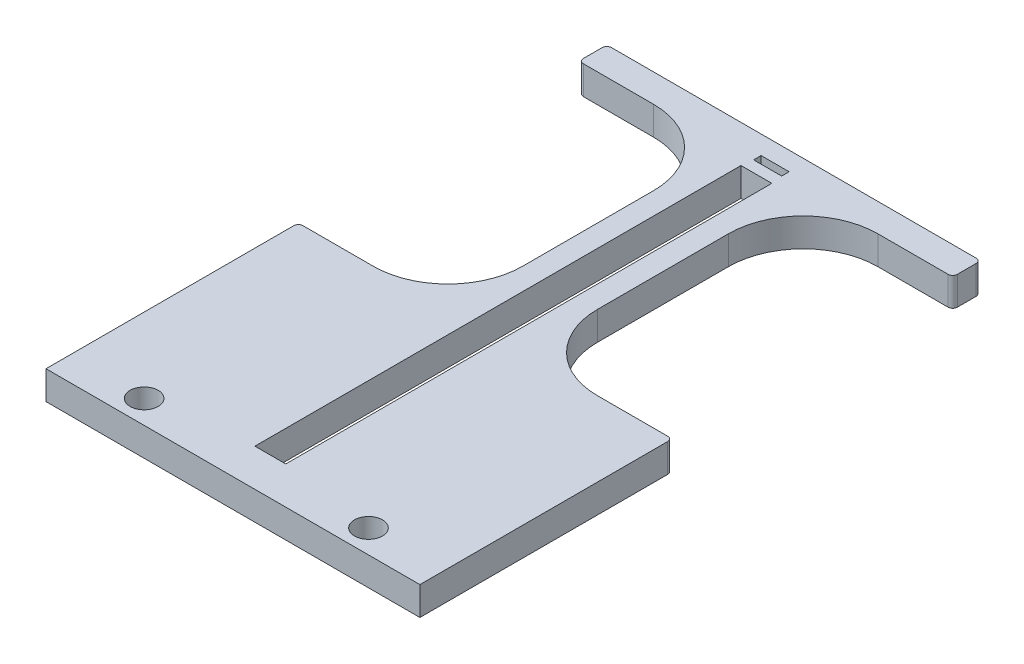
ISO-10303-21;
HEADER;
FILE_DESCRIPTION(('STEP AP214'),'2;1');
FILE_NAME('part.step','',(''),(''),'','','');
FILE_SCHEMA(('AUTOMOTIVE_DESIGN { 1 0 10303 214 1 1 1 1 }'));
ENDSEC;
DATA;
#1=APPLICATION_CONTEXT('core data for automotive mechanical design processes');
#2=APPLICATION_PROTOCOL_DEFINITION('international standard','automotive_design',2000,#1);
#3=PRODUCT_CONTEXT('',#1,'mechanical');
#4=PRODUCT('Part','Part','',(#3));
#5=PRODUCT_RELATED_PRODUCT_CATEGORY('part','',(#4));
#6=PRODUCT_DEFINITION_FORMATION('','',#4);
#7=PRODUCT_DEFINITION_CONTEXT('part definition',#1,'design');
#8=PRODUCT_DEFINITION('design','',#6,#7);
#9=PRODUCT_DEFINITION_SHAPE('','',#8);
#10=(LENGTH_UNIT() NAMED_UNIT(*) SI_UNIT(.MILLI.,.METRE.));
#11=(NAMED_UNIT(*) PLANE_ANGLE_UNIT() SI_UNIT($,.RADIAN.));
#12=(NAMED_UNIT(*) SI_UNIT($,.STERADIAN.) SOLID_ANGLE_UNIT());
#13=UNCERTAINTY_MEASURE_WITH_UNIT(LENGTH_MEASURE(1.E-05),#10,'distance_accuracy_value','');
#14=(GEOMETRIC_REPRESENTATION_CONTEXT(3) GLOBAL_UNCERTAINTY_ASSIGNED_CONTEXT((#13)) GLOBAL_UNIT_ASSIGNED_CONTEXT((#10,
#11,#12)) REPRESENTATION_CONTEXT('',''));
#15=CARTESIAN_POINT('',(0.,0.,0.));
#16=DIRECTION('',(0.,0.,1.));
#17=DIRECTION('',(1.,0.,0.));
#18=AXIS2_PLACEMENT_3D('',#15,#16,#17);
#19=CARTESIAN_POINT('',(40.,3.05,0.));
#20=DIRECTION('',(-1.,0.,0.));
#21=DIRECTION('',(0.,0.,1.));
#22=AXIS2_PLACEMENT_3D('',#19,#20,#21);
#23=PLANE('',#22);
#24=DIRECTION('',(0.,0.,-1.));
#25=VECTOR('',#24,1.);
#26=CARTESIAN_POINT('',(40.,0.,0.));
#27=LINE('',#26,#25);
#28=CARTESIAN_POINT('',(40.,0.,0.));
#29=VERTEX_POINT('',#28);
#30=CARTESIAN_POINT('',(40.,0.,-26.5));
#31=VERTEX_POINT('',#30);
#32=EDGE_CURVE('E406',#29,#31,#27,.T.);
#33=ORIENTED_EDGE('',*,*,#32,.T.);
#34=DIRECTION('',(0.,1.,0.));
#35=VECTOR('',#34,1.);
#36=CARTESIAN_POINT('',(40.,3.05,-26.5));
#37=LINE('',#36,#35);
#38=CARTESIAN_POINT('',(40.,3.05,-26.5));
#39=VERTEX_POINT('',#38);
#40=EDGE_CURVE('E536',#31,#39,#37,.T.);
#41=ORIENTED_EDGE('',*,*,#40,.T.);
#42=DIRECTION('',(0.,0.,-1.));
#43=VECTOR('',#42,1.);
#44=CARTESIAN_POINT('',(40.,3.05,0.));
#45=LINE('',#44,#43);
#46=CARTESIAN_POINT('',(40.,3.05,0.));
#47=VERTEX_POINT('',#46);
#48=EDGE_CURVE('E388',#47,#39,#45,.T.);
#49=ORIENTED_EDGE('',*,*,#48,.F.);
#50=DIRECTION('',(0.,-1.,0.));
#51=VECTOR('',#50,1.);
#52=CARTESIAN_POINT('',(40.,3.05,0.));
#53=LINE('',#52,#51);
#54=EDGE_CURVE('E419',#47,#29,#53,.T.);
#55=ORIENTED_EDGE('',*,*,#54,.T.);
#56=EDGE_LOOP('',(#33,#41,#49,#55));
#57=FACE_BOUND('',#56,.T.);
#58=ADVANCED_FACE('F44',(#57),#23,.F.);
#59=CARTESIAN_POINT('',(0.,3.05,0.));
#60=DIRECTION('',(-1.,0.,0.));
#61=DIRECTION('',(0.,0.,1.));
#62=AXIS2_PLACEMENT_3D('',#59,#60,#61);
#63=PLANE('',#62);
#64=DIRECTION('',(0.,0.,-1.));
#65=VECTOR('',#64,1.);
#66=CARTESIAN_POINT('',(0.,3.05,0.));
#67=LINE('',#66,#65);
#68=CARTESIAN_POINT('',(0.,3.05,-57.5));
#69=VERTEX_POINT('',#68);
#70=CARTESIAN_POINT('',(0.,3.05,-59.5));
#71=VERTEX_POINT('',#70);
#72=EDGE_CURVE('E396',#69,#71,#67,.T.);
#73=ORIENTED_EDGE('',*,*,#72,.T.);
#74=DIRECTION('',(0.,-1.,0.));
#75=VECTOR('',#74,1.);
#76=CARTESIAN_POINT('',(0.,3.05,-59.5));
#77=LINE('',#76,#75);
#78=CARTESIAN_POINT('',(0.,0.,-59.5));
#79=VERTEX_POINT('',#78);
#80=EDGE_CURVE('E53',#71,#79,#77,.T.);
#81=ORIENTED_EDGE('',*,*,#80,.T.);
#82=DIRECTION('',(0.,0.,-1.));
#83=VECTOR('',#82,1.);
#84=CARTESIAN_POINT('',(0.,0.,0.));
#85=LINE('',#84,#83);
#86=CARTESIAN_POINT('',(0.,0.,-57.5));
#87=VERTEX_POINT('',#86);
#88=EDGE_CURVE('E413',#87,#79,#85,.T.);
#89=ORIENTED_EDGE('',*,*,#88,.F.);
#90=DIRECTION('',(0.,1.,0.));
#91=VECTOR('',#90,1.);
#92=CARTESIAN_POINT('',(0.,3.05,-57.5));
#93=LINE('',#92,#91);
#94=EDGE_CURVE('E559',#87,#69,#93,.T.);
#95=ORIENTED_EDGE('',*,*,#94,.T.);
#96=EDGE_LOOP('',(#73,#81,#89,#95));
#97=FACE_BOUND('',#96,.T.);
#98=ADVANCED_FACE('F569',(#97),#63,.T.);
#99=CARTESIAN_POINT('',(0.,3.05,0.));
#100=DIRECTION('',(0.,1.,0.));
#101=DIRECTION('',(0.,0.,1.));
#102=AXIS2_PLACEMENT_3D('',#99,#100,#101);
#103=PLANE('',#102);
#104=CARTESIAN_POINT('',(8.,3.05,-2.5));
#105=DIRECTION('',(0.,1.,0.));
#106=DIRECTION('',(0.,0.,1.));
#107=AXIS2_PLACEMENT_3D('',#104,#105,#106);
#108=CIRCLE('',#107,1.5);
#109=CARTESIAN_POINT('',(8.,3.05,-1.));
#110=VERTEX_POINT('',#109);
#111=EDGE_CURVE('E492',#110,#110,#108,.T.);
#112=ORIENTED_EDGE('',*,*,#111,.F.);
#113=EDGE_LOOP('',(#112));
#114=FACE_BOUND('',#113,.T.);
#115=CARTESIAN_POINT('',(32.,3.05,-2.5));
#116=DIRECTION('',(0.,1.,0.));
#117=DIRECTION('',(0.,0.,1.));
#118=AXIS2_PLACEMENT_3D('',#115,#116,#117);
#119=CIRCLE('',#118,1.5);
#120=CARTESIAN_POINT('',(32.,3.05,-0.999999999999996));
#121=VERTEX_POINT('',#120);
#122=EDGE_CURVE('E1034',#121,#121,#119,.T.);
#123=ORIENTED_EDGE('',*,*,#122,.F.);
#124=EDGE_LOOP('',(#123));
#125=FACE_BOUND('',#124,.T.);
#126=DIRECTION('',(1.,0.,0.));
#127=VECTOR('',#126,1.);
#128=CARTESIAN_POINT('',(0.,3.05,-4.));
#129=LINE('',#128,#127);
#130=CARTESIAN_POINT('',(18.35,3.05,-4.));
#131=VERTEX_POINT('',#130);
#132=CARTESIAN_POINT('',(21.65,3.05,-4.));
#133=VERTEX_POINT('',#132);
#134=EDGE_CURVE('E326',#131,#133,#129,.T.);
#135=ORIENTED_EDGE('',*,*,#134,.F.);
#136=DIRECTION('',(0.,0.,1.));
#137=VECTOR('',#136,1.);
#138=CARTESIAN_POINT('',(18.35,3.05,0.));
#139=LINE('',#138,#137);
#140=CARTESIAN_POINT('',(18.35,3.05,-56.));
#141=VERTEX_POINT('',#140);
#142=EDGE_CURVE('E338',#141,#131,#139,.T.);
#143=ORIENTED_EDGE('',*,*,#142,.F.);
#144=DIRECTION('',(-1.,0.,0.));
#145=VECTOR('',#144,1.);
#146=CARTESIAN_POINT('',(0.,3.05,-56.));
#147=LINE('',#146,#145);
#148=CARTESIAN_POINT('',(21.65,3.05,-56.));
#149=VERTEX_POINT('',#148);
#150=EDGE_CURVE('E334',#149,#141,#147,.T.);
#151=ORIENTED_EDGE('',*,*,#150,.F.);
#152=DIRECTION('',(0.,0.,-1.));
#153=VECTOR('',#152,1.);
#154=CARTESIAN_POINT('',(21.65,3.05,0.));
#155=LINE('',#154,#153);
#156=EDGE_CURVE('E329',#133,#149,#155,.T.);
#157=ORIENTED_EDGE('',*,*,#156,.F.);
#158=EDGE_LOOP('',(#135,#143,#151,#157));
#159=FACE_BOUND('',#158,.T.);
#160=DIRECTION('',(1.,0.,0.));
#161=VECTOR('',#160,1.);
#162=CARTESIAN_POINT('',(0.,3.05,-57.2));
#163=LINE('',#162,#161);
#164=CARTESIAN_POINT('',(18.5,3.05,-57.2));
#165=VERTEX_POINT('',#164);
#166=CARTESIAN_POINT('',(21.5,3.05,-57.2));
#167=VERTEX_POINT('',#166);
#168=EDGE_CURVE('E288',#165,#167,#163,.T.);
#169=ORIENTED_EDGE('',*,*,#168,.F.);
#170=DIRECTION('',(0.,0.,1.));
#171=VECTOR('',#170,1.);
#172=CARTESIAN_POINT('',(18.5000000000003,3.05,0.));
#173=LINE('',#172,#171);
#174=CARTESIAN_POINT('',(18.5,3.05,-58.));
#175=VERTEX_POINT('',#174);
#176=EDGE_CURVE('E366',#175,#165,#173,.T.);
#177=ORIENTED_EDGE('',*,*,#176,.F.);
#178=DIRECTION('',(-1.,0.,0.));
#179=VECTOR('',#178,1.);
#180=CARTESIAN_POINT('',(0.,3.05,-58.));
#181=LINE('',#180,#179);
#182=CARTESIAN_POINT('',(21.5,3.05,-58.));
#183=VERTEX_POINT('',#182);
#184=EDGE_CURVE('E362',#183,#175,#181,.T.);
#185=ORIENTED_EDGE('',*,*,#184,.F.);
#186=DIRECTION('',(0.,0.,-1.));
#187=VECTOR('',#186,1.);
#188=CARTESIAN_POINT('',(21.4999999999995,3.05,1.86482773667502E-13));
#189=LINE('',#188,#187);
#190=EDGE_CURVE('E358',#167,#183,#189,.T.);
#191=ORIENTED_EDGE('',*,*,#190,.F.);
#192=EDGE_LOOP('',(#169,#177,#185,#191));
#193=FACE_BOUND('',#192,.T.);
#194=DIRECTION('',(1.,0.,0.));
#195=VECTOR('',#194,1.);
#196=CARTESIAN_POINT('',(0.,3.05,-27.));
#197=LINE('',#196,#195);
#198=CARTESIAN_POINT('',(0.5,3.05,-27.));
#199=VERTEX_POINT('',#198);
#200=CARTESIAN_POINT('',(8.,3.05,-27.));
#201=VERTEX_POINT('',#200);
#202=EDGE_CURVE('E243',#199,#201,#197,.T.);
#203=ORIENTED_EDGE('',*,*,#202,.F.);
#204=CARTESIAN_POINT('',(0.5,3.05,-26.5));
#205=DIRECTION('',(0.,1.,0.));
#206=DIRECTION('',(0.,0.,1.));
#207=AXIS2_PLACEMENT_3D('',#204,#205,#206);
#208=CIRCLE('',#207,0.5);
#209=CARTESIAN_POINT('',(0.,3.05,-26.5));
#210=VERTEX_POINT('',#209);
#211=EDGE_CURVE('E513',#199,#210,#208,.T.);
#212=ORIENTED_EDGE('',*,*,#211,.T.);
#213=CARTESIAN_POINT('',(0.,3.05,0.));
#214=VERTEX_POINT('',#213);
#215=EDGE_CURVE('E397',#214,#210,#67,.T.);
#216=ORIENTED_EDGE('',*,*,#215,.F.);
#217=DIRECTION('',(1.,0.,0.));
#218=VECTOR('',#217,1.);
#219=CARTESIAN_POINT('',(0.,3.05,0.));
#220=LINE('',#219,#218);
#221=EDGE_CURVE('E382',#214,#47,#220,.T.);
#222=ORIENTED_EDGE('',*,*,#221,.T.);
#223=ORIENTED_EDGE('',*,*,#48,.T.);
#224=CARTESIAN_POINT('',(39.5,3.05,-26.5));
#225=DIRECTION('',(0.,1.,0.));
#226=DIRECTION('',(0.,0.,1.));
#227=AXIS2_PLACEMENT_3D('',#224,#225,#226);
#228=CIRCLE('',#227,0.5);
#229=CARTESIAN_POINT('',(39.5,3.05,-27.));
#230=VERTEX_POINT('',#229);
#231=EDGE_CURVE('E510',#39,#230,#228,.T.);
#232=ORIENTED_EDGE('',*,*,#231,.T.);
#233=DIRECTION('',(-1.,0.,0.));
#234=VECTOR('',#233,1.);
#235=CARTESIAN_POINT('',(0.,3.05,-27.));
#236=LINE('',#235,#234);
#237=CARTESIAN_POINT('',(32.,3.05,-27.));
#238=VERTEX_POINT('',#237);
#239=EDGE_CURVE('E310',#230,#238,#236,.T.);
#240=ORIENTED_EDGE('',*,*,#239,.T.);
#241=CARTESIAN_POINT('',(32.,3.05,-35.));
#242=DIRECTION('',(0.,1.,0.));
#243=DIRECTION('',(0.,0.,1.));
#244=AXIS2_PLACEMENT_3D('',#241,#242,#243);
#245=CIRCLE('',#244,8.);
#246=CARTESIAN_POINT('',(24.,3.05,-35.));
#247=VERTEX_POINT('',#246);
#248=EDGE_CURVE('E306',#247,#238,#245,.T.);
#249=ORIENTED_EDGE('',*,*,#248,.F.);
#250=DIRECTION('',(0.,0.,1.));
#251=VECTOR('',#250,1.);
#252=CARTESIAN_POINT('',(24.,3.05,0.));
#253=LINE('',#252,#251);
#254=CARTESIAN_POINT('',(24.,3.05,-49.));
#255=VERTEX_POINT('',#254);
#256=EDGE_CURVE('E302',#255,#247,#253,.T.);
#257=ORIENTED_EDGE('',*,*,#256,.F.);
#258=CARTESIAN_POINT('',(32.,3.05,-49.));
#259=DIRECTION('',(0.,1.,0.));
#260=DIRECTION('',(0.,0.,1.));
#261=AXIS2_PLACEMENT_3D('',#258,#259,#260);
#262=CIRCLE('',#261,8.);
#263=CARTESIAN_POINT('',(32.,3.05,-57.));
#264=VERTEX_POINT('',#263);
#265=EDGE_CURVE('E297',#264,#255,#262,.T.);
#266=ORIENTED_EDGE('',*,*,#265,.F.);
#267=DIRECTION('',(-1.,0.,0.));
#268=VECTOR('',#267,1.);
#269=CARTESIAN_POINT('',(0.,3.05,-57.));
#270=LINE('',#269,#268);
#271=CARTESIAN_POINT('',(39.5,3.05,-57.));
#272=VERTEX_POINT('',#271);
#273=EDGE_CURVE('E294',#272,#264,#270,.T.);
#274=ORIENTED_EDGE('',*,*,#273,.F.);
#275=CARTESIAN_POINT('',(39.5,3.05,-57.5));
#276=DIRECTION('',(0.,1.,0.));
#277=DIRECTION('',(0.,0.,1.));
#278=AXIS2_PLACEMENT_3D('',#275,#276,#277);
#279=CIRCLE('',#278,0.5);
#280=CARTESIAN_POINT('',(40.,3.05,-57.5));
#281=VERTEX_POINT('',#280);
#282=EDGE_CURVE('E507',#272,#281,#279,.T.);
#283=ORIENTED_EDGE('',*,*,#282,.T.);
#284=CARTESIAN_POINT('',(40.,3.05,-59.5));
#285=VERTEX_POINT('',#284);
#286=EDGE_CURVE('E386',#281,#285,#45,.T.);
#287=ORIENTED_EDGE('',*,*,#286,.T.);
#288=CARTESIAN_POINT('',(39.5,3.05,-59.5));
#289=DIRECTION('',(0.,1.,0.));
#290=DIRECTION('',(0.,0.,1.));
#291=AXIS2_PLACEMENT_3D('',#288,#289,#290);
#292=CIRCLE('',#291,0.5);
#293=CARTESIAN_POINT('',(39.5,3.05,-60.));
#294=VERTEX_POINT('',#293);
#295=EDGE_CURVE('E504',#285,#294,#292,.T.);
#296=ORIENTED_EDGE('',*,*,#295,.T.);
#297=DIRECTION('',(1.,0.,0.));
#298=VECTOR('',#297,1.);
#299=CARTESIAN_POINT('',(0.,3.05,-60.));
#300=LINE('',#299,#298);
#301=CARTESIAN_POINT('',(0.5,3.05,-60.));
#302=VERTEX_POINT('',#301);
#303=EDGE_CURVE('E392',#302,#294,#300,.T.);
#304=ORIENTED_EDGE('',*,*,#303,.F.);
#305=CARTESIAN_POINT('',(0.5,3.05,-59.5));
#306=DIRECTION('',(0.,1.,0.));
#307=DIRECTION('',(0.,0.,1.));
#308=AXIS2_PLACEMENT_3D('',#305,#306,#307);
#309=CIRCLE('',#308,0.5);
#310=EDGE_CURVE('E501',#302,#71,#309,.T.);
#311=ORIENTED_EDGE('',*,*,#310,.T.);
#312=ORIENTED_EDGE('',*,*,#72,.F.);
#313=CARTESIAN_POINT('',(0.5,3.05,-57.5));
#314=DIRECTION('',(0.,1.,0.));
#315=DIRECTION('',(0.,0.,1.));
#316=AXIS2_PLACEMENT_3D('',#313,#314,#315);
#317=CIRCLE('',#316,0.5);
#318=CARTESIAN_POINT('',(0.5,3.05,-57.));
#319=VERTEX_POINT('',#318);
#320=EDGE_CURVE('E498',#69,#319,#317,.T.);
#321=ORIENTED_EDGE('',*,*,#320,.T.);
#322=DIRECTION('',(1.,0.,0.));
#323=VECTOR('',#322,1.);
#324=CARTESIAN_POINT('',(0.,3.05,-57.));
#325=LINE('',#324,#323);
#326=CARTESIAN_POINT('',(8.,3.05,-57.));
#327=VERTEX_POINT('',#326);
#328=EDGE_CURVE('E266',#319,#327,#325,.T.);
#329=ORIENTED_EDGE('',*,*,#328,.T.);
#330=CARTESIAN_POINT('',(8.,3.05,-49.));
#331=DIRECTION('',(0.,1.,0.));
#332=DIRECTION('',(0.,0.,1.));
#333=AXIS2_PLACEMENT_3D('',#330,#331,#332);
#334=CIRCLE('',#333,8.);
#335=CARTESIAN_POINT('',(16.,3.05,-49.));
#336=VERTEX_POINT('',#335);
#337=EDGE_CURVE('E275',#336,#327,#334,.T.);
#338=ORIENTED_EDGE('',*,*,#337,.F.);
#339=DIRECTION('',(0.,0.,1.));
#340=VECTOR('',#339,1.);
#341=CARTESIAN_POINT('',(16.,3.05,0.));
#342=LINE('',#341,#340);
#343=CARTESIAN_POINT('',(16.,3.05,-35.));
#344=VERTEX_POINT('',#343);
#345=EDGE_CURVE('E271',#336,#344,#342,.T.);
#346=ORIENTED_EDGE('',*,*,#345,.T.);
#347=CARTESIAN_POINT('',(8.,3.05,-35.));
#348=DIRECTION('',(0.,1.,0.));
#349=DIRECTION('',(0.,0.,1.));
#350=AXIS2_PLACEMENT_3D('',#347,#348,#349);
#351=CIRCLE('',#350,8.);
#352=EDGE_CURVE('E254',#201,#344,#351,.T.);
#353=ORIENTED_EDGE('',*,*,#352,.F.);
#354=EDGE_LOOP('',(#203,#212,#216,#222,#223,#232,#240,#249,#257,#266,#274,#283,#287,#296,#304,
#311,#312,#321,#329,#338,#346,#353));
#355=FACE_BOUND('',#354,.T.);
#356=ADVANCED_FACE('F268',(#114,#125,#159,#193,#355),#103,.T.);
#357=CARTESIAN_POINT('',(0.,0.,0.));
#358=DIRECTION('',(0.,1.,0.));
#359=DIRECTION('',(0.,0.,1.));
#360=AXIS2_PLACEMENT_3D('',#357,#358,#359);
#361=PLANE('',#360);
#362=CARTESIAN_POINT('',(8.,0.,-2.5));
#363=DIRECTION('',(0.,1.,0.));
#364=DIRECTION('',(0.,0.,1.));
#365=AXIS2_PLACEMENT_3D('',#362,#363,#364);
#366=CIRCLE('',#365,1.5);
#367=CARTESIAN_POINT('',(8.,0.,-1.));
#368=VERTEX_POINT('',#367);
#369=EDGE_CURVE('E298',#368,#368,#366,.T.);
#370=ORIENTED_EDGE('',*,*,#369,.T.);
#371=EDGE_LOOP('',(#370));
#372=FACE_BOUND('',#371,.T.);
#373=CARTESIAN_POINT('',(32.,0.,-2.5));
#374=DIRECTION('',(0.,1.,0.));
#375=DIRECTION('',(0.,0.,1.));
#376=AXIS2_PLACEMENT_3D('',#373,#374,#375);
#377=CIRCLE('',#376,1.5);
#378=CARTESIAN_POINT('',(32.,0.,-0.999999999999996));
#379=VERTEX_POINT('',#378);
#380=EDGE_CURVE('E488',#379,#379,#377,.T.);
#381=ORIENTED_EDGE('',*,*,#380,.T.);
#382=EDGE_LOOP('',(#381));
#383=FACE_BOUND('',#382,.T.);
#384=DIRECTION('',(0.,0.,1.));
#385=VECTOR('',#384,1.);
#386=CARTESIAN_POINT('',(18.35,0.,0.));
#387=LINE('',#386,#385);
#388=CARTESIAN_POINT('',(18.35,0.,-56.));
#389=VERTEX_POINT('',#388);
#390=CARTESIAN_POINT('',(18.35,0.,-4.));
#391=VERTEX_POINT('',#390);
#392=EDGE_CURVE('E447',#389,#391,#387,.T.);
#393=ORIENTED_EDGE('',*,*,#392,.T.);
#394=DIRECTION('',(1.,0.,0.));
#395=VECTOR('',#394,1.);
#396=CARTESIAN_POINT('',(0.,0.,-4.));
#397=LINE('',#396,#395);
#398=CARTESIAN_POINT('',(21.65,0.,-4.));
#399=VERTEX_POINT('',#398);
#400=EDGE_CURVE('E451',#391,#399,#397,.T.);
#401=ORIENTED_EDGE('',*,*,#400,.T.);
#402=DIRECTION('',(0.,0.,-1.));
#403=VECTOR('',#402,1.);
#404=CARTESIAN_POINT('',(21.65,0.,0.));
#405=LINE('',#404,#403);
#406=CARTESIAN_POINT('',(21.65,0.,-56.));
#407=VERTEX_POINT('',#406);
#408=EDGE_CURVE('E439',#399,#407,#405,.T.);
#409=ORIENTED_EDGE('',*,*,#408,.T.);
#410=DIRECTION('',(-1.,0.,0.));
#411=VECTOR('',#410,1.);
#412=CARTESIAN_POINT('',(0.,0.,-56.));
#413=LINE('',#412,#411);
#414=EDGE_CURVE('E443',#407,#389,#413,.T.);
#415=ORIENTED_EDGE('',*,*,#414,.T.);
#416=EDGE_LOOP('',(#393,#401,#409,#415));
#417=FACE_BOUND('',#416,.T.);
#418=DIRECTION('',(0.,0.,1.));
#419=VECTOR('',#418,1.);
#420=CARTESIAN_POINT('',(18.5000000000003,0.,0.));
#421=LINE('',#420,#419);
#422=CARTESIAN_POINT('',(18.5,0.,-58.));
#423=VERTEX_POINT('',#422);
#424=CARTESIAN_POINT('',(18.5,0.,-57.2));
#425=VERTEX_POINT('',#424);
#426=EDGE_CURVE('E431',#423,#425,#421,.T.);
#427=ORIENTED_EDGE('',*,*,#426,.T.);
#428=DIRECTION('',(1.,0.,0.));
#429=VECTOR('',#428,1.);
#430=CARTESIAN_POINT('',(0.,0.,-57.2));
#431=LINE('',#430,#429);
#432=CARTESIAN_POINT('',(21.5,0.,-57.2));
#433=VERTEX_POINT('',#432);
#434=EDGE_CURVE('E435',#425,#433,#431,.T.);
#435=ORIENTED_EDGE('',*,*,#434,.T.);
#436=DIRECTION('',(0.,0.,-1.));
#437=VECTOR('',#436,1.);
#438=CARTESIAN_POINT('',(21.4999999999995,0.,1.86482773667502E-13));
#439=LINE('',#438,#437);
#440=CARTESIAN_POINT('',(21.5,0.,-58.));
#441=VERTEX_POINT('',#440);
#442=EDGE_CURVE('E423',#433,#441,#439,.T.);
#443=ORIENTED_EDGE('',*,*,#442,.T.);
#444=DIRECTION('',(-1.,0.,0.));
#445=VECTOR('',#444,1.);
#446=CARTESIAN_POINT('',(0.,0.,-58.));
#447=LINE('',#446,#445);
#448=EDGE_CURVE('E427',#441,#423,#447,.T.);
#449=ORIENTED_EDGE('',*,*,#448,.T.);
#450=EDGE_LOOP('',(#427,#435,#443,#449));
#451=FACE_BOUND('',#450,.T.);
#452=CARTESIAN_POINT('',(0.,0.,0.));
#453=VERTEX_POINT('',#452);
#454=CARTESIAN_POINT('',(0.,0.,-26.5));
#455=VERTEX_POINT('',#454);
#456=EDGE_CURVE('E387',#453,#455,#85,.T.);
#457=ORIENTED_EDGE('',*,*,#456,.T.);
#458=CARTESIAN_POINT('',(0.5,0.,-26.5));
#459=DIRECTION('',(0.,1.,0.));
#460=DIRECTION('',(0.,0.,1.));
#461=AXIS2_PLACEMENT_3D('',#458,#459,#460);
#462=CIRCLE('',#461,0.5);
#463=CARTESIAN_POINT('',(0.5,0.,-27.));
#464=VERTEX_POINT('',#463);
#465=EDGE_CURVE('E533',#455,#464,#462,.F.);
#466=ORIENTED_EDGE('',*,*,#465,.T.);
#467=DIRECTION('',(1.,0.,0.));
#468=VECTOR('',#467,1.);
#469=CARTESIAN_POINT('',(0.,0.,-27.));
#470=LINE('',#469,#468);
#471=CARTESIAN_POINT('',(8.,0.,-27.));
#472=VERTEX_POINT('',#471);
#473=EDGE_CURVE('E473',#464,#472,#470,.T.);
#474=ORIENTED_EDGE('',*,*,#473,.T.);
#475=CARTESIAN_POINT('',(8.,0.,-35.));
#476=DIRECTION('',(0.,1.,0.));
#477=DIRECTION('',(0.,0.,1.));
#478=AXIS2_PLACEMENT_3D('',#475,#476,#477);
#479=CIRCLE('',#478,8.);
#480=CARTESIAN_POINT('',(16.,0.,-35.));
#481=VERTEX_POINT('',#480);
#482=EDGE_CURVE('E263',#472,#481,#479,.T.);
#483=ORIENTED_EDGE('',*,*,#482,.T.);
#484=DIRECTION('',(0.,0.,1.));
#485=VECTOR('',#484,1.);
#486=CARTESIAN_POINT('',(16.,0.,0.));
#487=LINE('',#486,#485);
#488=CARTESIAN_POINT('',(16.,0.,-49.));
#489=VERTEX_POINT('',#488);
#490=EDGE_CURVE('E478',#489,#481,#487,.T.);
#491=ORIENTED_EDGE('',*,*,#490,.F.);
#492=CARTESIAN_POINT('',(8.,0.,-49.));
#493=DIRECTION('',(0.,1.,0.));
#494=DIRECTION('',(0.,0.,1.));
#495=AXIS2_PLACEMENT_3D('',#492,#493,#494);
#496=CIRCLE('',#495,8.);
#497=CARTESIAN_POINT('',(8.,0.,-57.));
#498=VERTEX_POINT('',#497);
#499=EDGE_CURVE('E481',#489,#498,#496,.T.);
#500=ORIENTED_EDGE('',*,*,#499,.T.);
#501=DIRECTION('',(1.,0.,0.));
#502=VECTOR('',#501,1.);
#503=CARTESIAN_POINT('',(0.,0.,-57.));
#504=LINE('',#503,#502);
#505=CARTESIAN_POINT('',(0.5,0.,-57.));
#506=VERTEX_POINT('',#505);
#507=EDGE_CURVE('E485',#506,#498,#504,.T.);
#508=ORIENTED_EDGE('',*,*,#507,.F.);
#509=CARTESIAN_POINT('',(0.5,0.,-57.5));
#510=DIRECTION('',(0.,1.,0.));
#511=DIRECTION('',(0.,0.,1.));
#512=AXIS2_PLACEMENT_3D('',#509,#510,#511);
#513=CIRCLE('',#512,0.5);
#514=EDGE_CURVE('E519',#506,#87,#513,.F.);
#515=ORIENTED_EDGE('',*,*,#514,.T.);
#516=ORIENTED_EDGE('',*,*,#88,.T.);
#517=CARTESIAN_POINT('',(0.5,0.,-59.5));
#518=DIRECTION('',(0.,1.,0.));
#519=DIRECTION('',(0.,0.,1.));
#520=AXIS2_PLACEMENT_3D('',#517,#518,#519);
#521=CIRCLE('',#520,0.5);
#522=CARTESIAN_POINT('',(0.5,0.,-60.));
#523=VERTEX_POINT('',#522);
#524=EDGE_CURVE('E522',#79,#523,#521,.F.);
#525=ORIENTED_EDGE('',*,*,#524,.T.);
#526=DIRECTION('',(1.,0.,0.));
#527=VECTOR('',#526,1.);
#528=CARTESIAN_POINT('',(0.,0.,-60.));
#529=LINE('',#528,#527);
#530=CARTESIAN_POINT('',(39.5,0.,-60.));
#531=VERTEX_POINT('',#530);
#532=EDGE_CURVE('E409',#523,#531,#529,.T.);
#533=ORIENTED_EDGE('',*,*,#532,.T.);
#534=CARTESIAN_POINT('',(39.5,0.,-59.5));
#535=DIRECTION('',(0.,1.,0.));
#536=DIRECTION('',(0.,0.,1.));
#537=AXIS2_PLACEMENT_3D('',#534,#535,#536);
#538=CIRCLE('',#537,0.5);
#539=CARTESIAN_POINT('',(40.,0.,-59.5));
#540=VERTEX_POINT('',#539);
#541=EDGE_CURVE('E525',#531,#540,#538,.F.);
#542=ORIENTED_EDGE('',*,*,#541,.T.);
#543=CARTESIAN_POINT('',(40.,0.,-57.5));
#544=VERTEX_POINT('',#543);
#545=EDGE_CURVE('E405',#544,#540,#27,.T.);
#546=ORIENTED_EDGE('',*,*,#545,.F.);
#547=CARTESIAN_POINT('',(39.5,0.,-57.5));
#548=DIRECTION('',(0.,1.,0.));
#549=DIRECTION('',(0.,0.,1.));
#550=AXIS2_PLACEMENT_3D('',#547,#548,#549);
#551=CIRCLE('',#550,0.5);
#552=CARTESIAN_POINT('',(39.5,0.,-57.));
#553=VERTEX_POINT('',#552);
#554=EDGE_CURVE('E528',#544,#553,#551,.F.);
#555=ORIENTED_EDGE('',*,*,#554,.T.);
#556=DIRECTION('',(-1.,0.,0.));
#557=VECTOR('',#556,1.);
#558=CARTESIAN_POINT('',(0.,0.,-57.));
#559=LINE('',#558,#557);
#560=CARTESIAN_POINT('',(32.,0.,-57.));
#561=VERTEX_POINT('',#560);
#562=EDGE_CURVE('E455',#553,#561,#559,.T.);
#563=ORIENTED_EDGE('',*,*,#562,.T.);
#564=CARTESIAN_POINT('',(32.,0.,-49.));
#565=DIRECTION('',(0.,1.,0.));
#566=DIRECTION('',(0.,0.,1.));
#567=AXIS2_PLACEMENT_3D('',#564,#565,#566);
#568=CIRCLE('',#567,8.);
#569=CARTESIAN_POINT('',(24.,0.,-49.));
#570=VERTEX_POINT('',#569);
#571=EDGE_CURVE('E458',#561,#570,#568,.T.);
#572=ORIENTED_EDGE('',*,*,#571,.T.);
#573=DIRECTION('',(0.,0.,1.));
#574=VECTOR('',#573,1.);
#575=CARTESIAN_POINT('',(24.,0.,0.));
#576=LINE('',#575,#574);
#577=CARTESIAN_POINT('',(24.,0.,-35.));
#578=VERTEX_POINT('',#577);
#579=EDGE_CURVE('E462',#570,#578,#576,.T.);
#580=ORIENTED_EDGE('',*,*,#579,.T.);
#581=CARTESIAN_POINT('',(32.,0.,-35.));
#582=DIRECTION('',(0.,1.,0.));
#583=DIRECTION('',(0.,0.,1.));
#584=AXIS2_PLACEMENT_3D('',#581,#582,#583);
#585=CIRCLE('',#584,8.);
#586=CARTESIAN_POINT('',(32.,0.,-27.));
#587=VERTEX_POINT('',#586);
#588=EDGE_CURVE('E466',#578,#587,#585,.T.);
#589=ORIENTED_EDGE('',*,*,#588,.T.);
#590=DIRECTION('',(-1.,0.,0.));
#591=VECTOR('',#590,1.);
#592=CARTESIAN_POINT('',(0.,0.,-27.));
#593=LINE('',#592,#591);
#594=CARTESIAN_POINT('',(39.5,0.,-27.));
#595=VERTEX_POINT('',#594);
#596=EDGE_CURVE('E470',#595,#587,#593,.T.);
#597=ORIENTED_EDGE('',*,*,#596,.F.);
#598=CARTESIAN_POINT('',(39.5,0.,-26.5));
#599=DIRECTION('',(0.,1.,0.));
#600=DIRECTION('',(0.,0.,1.));
#601=AXIS2_PLACEMENT_3D('',#598,#599,#600);
#602=CIRCLE('',#601,0.5);
#603=EDGE_CURVE('E60',#595,#31,#602,.F.);
#604=ORIENTED_EDGE('',*,*,#603,.T.);
#605=ORIENTED_EDGE('',*,*,#32,.F.);
#606=DIRECTION('',(1.,0.,0.));
#607=VECTOR('',#606,1.);
#608=CARTESIAN_POINT('',(0.,0.,0.));
#609=LINE('',#608,#607);
#610=EDGE_CURVE('E346',#453,#29,#609,.T.);
#611=ORIENTED_EDGE('',*,*,#610,.F.);
#612=EDGE_LOOP('',(#457,#466,#474,#483,#491,#500,#508,#515,#516,#525,#533,#542,#546,#555,#563,
#572,#580,#589,#597,#604,#605,#611));
#613=FACE_BOUND('',#612,.T.);
#614=ADVANCED_FACE('F574',(#372,#383,#417,#451,#613),#361,.F.);
#615=CARTESIAN_POINT('',(0.,3.05,0.));
#616=DIRECTION('',(0.,0.,-1.));
#617=DIRECTION('',(-1.,0.,0.));
#618=AXIS2_PLACEMENT_3D('',#615,#616,#617);
#619=PLANE('',#618);
#620=ORIENTED_EDGE('',*,*,#610,.T.);
#621=ORIENTED_EDGE('',*,*,#54,.F.);
#622=ORIENTED_EDGE('',*,*,#221,.F.);
#623=DIRECTION('',(0.,-1.,0.));
#624=VECTOR('',#623,1.);
#625=CARTESIAN_POINT('',(0.,3.05,0.));
#626=LINE('',#625,#624);
#627=EDGE_CURVE('E401',#214,#453,#626,.T.);
#628=ORIENTED_EDGE('',*,*,#627,.T.);
#629=EDGE_LOOP('',(#620,#621,#622,#628));
#630=FACE_BOUND('',#629,.T.);
#631=ADVANCED_FACE('F622',(#630),#619,.F.);
#632=ORIENTED_EDGE('',*,*,#286,.F.);
#633=DIRECTION('',(0.,1.,0.));
#634=VECTOR('',#633,1.);
#635=CARTESIAN_POINT('',(40.,3.05,-57.5));
#636=LINE('',#635,#634);
#637=EDGE_CURVE('E549',#281,#544,#636,.F.);
#638=ORIENTED_EDGE('',*,*,#637,.T.);
#639=ORIENTED_EDGE('',*,*,#545,.T.);
#640=DIRECTION('',(0.,-1.,0.));
#641=VECTOR('',#640,1.);
#642=CARTESIAN_POINT('',(40.,3.05,-59.5));
#643=LINE('',#642,#641);
#644=EDGE_CURVE('E546',#540,#285,#643,.F.);
#645=ORIENTED_EDGE('',*,*,#644,.T.);
#646=EDGE_LOOP('',(#632,#638,#639,#645));
#647=FACE_BOUND('',#646,.T.);
#648=ADVANCED_FACE('F585',(#647),#23,.F.);
#649=CARTESIAN_POINT('',(0.,3.05,-60.));
#650=DIRECTION('',(0.,0.,-1.));
#651=DIRECTION('',(-1.,0.,0.));
#652=AXIS2_PLACEMENT_3D('',#649,#650,#651);
#653=PLANE('',#652);
#654=ORIENTED_EDGE('',*,*,#303,.T.);
#655=DIRECTION('',(0.,-1.,0.));
#656=VECTOR('',#655,1.);
#657=CARTESIAN_POINT('',(39.5,0.,-60.));
#658=LINE('',#657,#656);
#659=EDGE_CURVE('E555',#294,#531,#658,.T.);
#660=ORIENTED_EDGE('',*,*,#659,.T.);
#661=ORIENTED_EDGE('',*,*,#532,.F.);
#662=DIRECTION('',(0.,-1.,0.));
#663=VECTOR('',#662,1.);
#664=CARTESIAN_POINT('',(0.5,3.05,-60.));
#665=LINE('',#664,#663);
#666=EDGE_CURVE('E552',#523,#302,#665,.F.);
#667=ORIENTED_EDGE('',*,*,#666,.T.);
#668=EDGE_LOOP('',(#654,#660,#661,#667));
#669=FACE_BOUND('',#668,.T.);
#670=ADVANCED_FACE('F595',(#669),#653,.T.);
#671=ORIENTED_EDGE('',*,*,#215,.T.);
#672=DIRECTION('',(0.,1.,0.));
#673=VECTOR('',#672,1.);
#674=CARTESIAN_POINT('',(0.,0.,-26.5));
#675=LINE('',#674,#673);
#676=EDGE_CURVE('E516',#210,#455,#675,.F.);
#677=ORIENTED_EDGE('',*,*,#676,.T.);
#678=ORIENTED_EDGE('',*,*,#456,.F.);
#679=ORIENTED_EDGE('',*,*,#627,.F.);
#680=EDGE_LOOP('',(#671,#677,#678,#679));
#681=FACE_BOUND('',#680,.T.);
#682=ADVANCED_FACE('F618',(#681),#63,.T.);
#683=CARTESIAN_POINT('',(0.,-6.95,-57.2));
#684=DIRECTION('',(0.,0.,1.));
#685=DIRECTION('',(1.,0.,0.));
#686=AXIS2_PLACEMENT_3D('',#683,#684,#685);
#687=PLANE('',#686);
#688=DIRECTION('',(0.,1.,0.));
#689=VECTOR('',#688,1.);
#690=CARTESIAN_POINT('',(18.5,-6.95,-57.2));
#691=LINE('',#690,#689);
#692=EDGE_CURVE('E330',#425,#165,#691,.T.);
#693=ORIENTED_EDGE('',*,*,#692,.T.);
#694=ORIENTED_EDGE('',*,*,#168,.T.);
#695=DIRECTION('',(0.,1.,0.));
#696=VECTOR('',#695,1.);
#697=CARTESIAN_POINT('',(21.5,-6.95,-57.2));
#698=LINE('',#697,#696);
#699=EDGE_CURVE('E370',#433,#167,#698,.T.);
#700=ORIENTED_EDGE('',*,*,#699,.F.);
#701=ORIENTED_EDGE('',*,*,#434,.F.);
#702=EDGE_LOOP('',(#693,#694,#700,#701));
#703=FACE_BOUND('',#702,.T.);
#704=ADVANCED_FACE('F892',(#703),#687,.F.);
#705=CARTESIAN_POINT('',(18.5000000000003,-6.95,0.));
#706=DIRECTION('',(-1.,0.,0.));
#707=DIRECTION('',(0.,0.,1.));
#708=AXIS2_PLACEMENT_3D('',#705,#706,#707);
#709=PLANE('',#708);
#710=DIRECTION('',(0.,1.,0.));
#711=VECTOR('',#710,1.);
#712=CARTESIAN_POINT('',(18.5,-6.95,-58.));
#713=LINE('',#712,#711);
#714=EDGE_CURVE('E373',#423,#175,#713,.T.);
#715=ORIENTED_EDGE('',*,*,#714,.T.);
#716=ORIENTED_EDGE('',*,*,#176,.T.);
#717=ORIENTED_EDGE('',*,*,#692,.F.);
#718=ORIENTED_EDGE('',*,*,#426,.F.);
#719=EDGE_LOOP('',(#715,#716,#717,#718));
#720=FACE_BOUND('',#719,.T.);
#721=ADVANCED_FACE('F882',(#720),#709,.F.);
#722=CARTESIAN_POINT('',(0.,-6.95,-58.));
#723=DIRECTION('',(0.,0.,-1.));
#724=DIRECTION('',(-1.,0.,0.));
#725=AXIS2_PLACEMENT_3D('',#722,#723,#724);
#726=PLANE('',#725);
#727=DIRECTION('',(0.,1.,0.));
#728=VECTOR('',#727,1.);
#729=CARTESIAN_POINT('',(21.5,-6.95,-58.));
#730=LINE('',#729,#728);
#731=EDGE_CURVE('E376',#441,#183,#730,.T.);
#732=ORIENTED_EDGE('',*,*,#731,.T.);
#733=ORIENTED_EDGE('',*,*,#184,.T.);
#734=ORIENTED_EDGE('',*,*,#714,.F.);
#735=ORIENTED_EDGE('',*,*,#448,.F.);
#736=EDGE_LOOP('',(#732,#733,#734,#735));
#737=FACE_BOUND('',#736,.T.);
#738=ADVANCED_FACE('F872',(#737),#726,.F.);
#739=CARTESIAN_POINT('',(21.4999999999995,-6.95,1.86482773667502E-13));
#740=DIRECTION('',(1.,0.,0.));
#741=DIRECTION('',(0.,0.,-1.));
#742=AXIS2_PLACEMENT_3D('',#739,#740,#741);
#743=PLANE('',#742);
#744=ORIENTED_EDGE('',*,*,#699,.T.);
#745=ORIENTED_EDGE('',*,*,#190,.T.);
#746=ORIENTED_EDGE('',*,*,#731,.F.);
#747=ORIENTED_EDGE('',*,*,#442,.F.);
#748=EDGE_LOOP('',(#744,#745,#746,#747));
#749=FACE_BOUND('',#748,.T.);
#750=ADVANCED_FACE('F862',(#749),#743,.F.);
#751=CARTESIAN_POINT('',(0.,-6.95,-4.));
#752=DIRECTION('',(0.,0.,1.));
#753=DIRECTION('',(1.,0.,0.));
#754=AXIS2_PLACEMENT_3D('',#751,#752,#753);
#755=PLANE('',#754);
#756=DIRECTION('',(0.,1.,0.));
#757=VECTOR('',#756,1.);
#758=CARTESIAN_POINT('',(18.35,-6.95,-4.));
#759=LINE('',#758,#757);
#760=EDGE_CURVE('E343',#391,#131,#759,.T.);
#761=ORIENTED_EDGE('',*,*,#760,.T.);
#762=ORIENTED_EDGE('',*,*,#134,.T.);
#763=DIRECTION('',(0.,1.,0.));
#764=VECTOR('',#763,1.);
#765=CARTESIAN_POINT('',(21.65,-6.95,-4.));
#766=LINE('',#765,#764);
#767=EDGE_CURVE('E342',#399,#133,#766,.T.);
#768=ORIENTED_EDGE('',*,*,#767,.F.);
#769=ORIENTED_EDGE('',*,*,#400,.F.);
#770=EDGE_LOOP('',(#761,#762,#768,#769));
#771=FACE_BOUND('',#770,.T.);
#772=ADVANCED_FACE('F852',(#771),#755,.F.);
#773=CARTESIAN_POINT('',(18.35,-6.95,0.));
#774=DIRECTION('',(-1.,0.,0.));
#775=DIRECTION('',(0.,0.,1.));
#776=AXIS2_PLACEMENT_3D('',#773,#774,#775);
#777=PLANE('',#776);
#778=DIRECTION('',(0.,1.,0.));
#779=VECTOR('',#778,1.);
#780=CARTESIAN_POINT('',(18.35,-6.95,-56.));
#781=LINE('',#780,#779);
#782=EDGE_CURVE('E347',#389,#141,#781,.T.);
#783=ORIENTED_EDGE('',*,*,#782,.T.);
#784=ORIENTED_EDGE('',*,*,#142,.T.);
#785=ORIENTED_EDGE('',*,*,#760,.F.);
#786=ORIENTED_EDGE('',*,*,#392,.F.);
#787=EDGE_LOOP('',(#783,#784,#785,#786));
#788=FACE_BOUND('',#787,.T.);
#789=ADVANCED_FACE('F842',(#788),#777,.F.);
#790=CARTESIAN_POINT('',(0.,-6.95,-56.));
#791=DIRECTION('',(0.,0.,-1.));
#792=DIRECTION('',(-1.,0.,0.));
#793=AXIS2_PLACEMENT_3D('',#790,#791,#792);
#794=PLANE('',#793);
#795=DIRECTION('',(0.,1.,0.));
#796=VECTOR('',#795,1.);
#797=CARTESIAN_POINT('',(21.65,-6.95,-56.));
#798=LINE('',#797,#796);
#799=EDGE_CURVE('E350',#407,#149,#798,.T.);
#800=ORIENTED_EDGE('',*,*,#799,.T.);
#801=ORIENTED_EDGE('',*,*,#150,.T.);
#802=ORIENTED_EDGE('',*,*,#782,.F.);
#803=ORIENTED_EDGE('',*,*,#414,.F.);
#804=EDGE_LOOP('',(#800,#801,#802,#803));
#805=FACE_BOUND('',#804,.T.);
#806=ADVANCED_FACE('F832',(#805),#794,.F.);
#807=CARTESIAN_POINT('',(21.65,-6.95,0.));
#808=DIRECTION('',(1.,0.,0.));
#809=DIRECTION('',(0.,0.,-1.));
#810=AXIS2_PLACEMENT_3D('',#807,#808,#809);
#811=PLANE('',#810);
#812=ORIENTED_EDGE('',*,*,#767,.T.);
#813=ORIENTED_EDGE('',*,*,#156,.T.);
#814=ORIENTED_EDGE('',*,*,#799,.F.);
#815=ORIENTED_EDGE('',*,*,#408,.F.);
#816=EDGE_LOOP('',(#812,#813,#814,#815));
#817=FACE_BOUND('',#816,.T.);
#818=ADVANCED_FACE('F798',(#817),#811,.F.);
#819=CARTESIAN_POINT('',(0.,-6.95,-27.));
#820=DIRECTION('',(0.,0.,-1.));
#821=DIRECTION('',(-1.,0.,0.));
#822=AXIS2_PLACEMENT_3D('',#819,#820,#821);
#823=PLANE('',#822);
#824=ORIENTED_EDGE('',*,*,#239,.F.);
#825=DIRECTION('',(0.,1.,0.));
#826=VECTOR('',#825,1.);
#827=CARTESIAN_POINT('',(39.5,0.,-27.));
#828=LINE('',#827,#826);
#829=EDGE_CURVE('E68',#230,#595,#828,.F.);
#830=ORIENTED_EDGE('',*,*,#829,.T.);
#831=ORIENTED_EDGE('',*,*,#596,.T.);
#832=DIRECTION('',(0.,1.,0.));
#833=VECTOR('',#832,1.);
#834=CARTESIAN_POINT('',(32.,-6.95,-27.));
#835=LINE('',#834,#833);
#836=EDGE_CURVE('E255',#587,#238,#835,.T.);
#837=ORIENTED_EDGE('',*,*,#836,.T.);
#838=EDGE_LOOP('',(#824,#830,#831,#837));
#839=FACE_BOUND('',#838,.T.);
#840=ADVANCED_FACE('F788',(#839),#823,.T.);
#841=CARTESIAN_POINT('',(32.,-6.95,-35.));
#842=DIRECTION('',(0.,1.,0.));
#843=DIRECTION('',(0.,0.,1.));
#844=AXIS2_PLACEMENT_3D('',#841,#842,#843);
#845=CYLINDRICAL_SURFACE('',#844,8.);
#846=DIRECTION('',(0.,1.,0.));
#847=VECTOR('',#846,1.);
#848=CARTESIAN_POINT('',(24.,-6.95,-35.));
#849=LINE('',#848,#847);
#850=EDGE_CURVE('E317',#578,#247,#849,.T.);
#851=ORIENTED_EDGE('',*,*,#850,.T.);
#852=ORIENTED_EDGE('',*,*,#248,.T.);
#853=ORIENTED_EDGE('',*,*,#836,.F.);
#854=ORIENTED_EDGE('',*,*,#588,.F.);
#855=EDGE_LOOP('',(#851,#852,#853,#854));
#856=FACE_BOUND('',#855,.T.);
#857=ADVANCED_FACE('F778',(#856),#845,.F.);
#858=CARTESIAN_POINT('',(24.,-6.95,0.));
#859=DIRECTION('',(-1.,0.,0.));
#860=DIRECTION('',(0.,0.,1.));
#861=AXIS2_PLACEMENT_3D('',#858,#859,#860);
#862=PLANE('',#861);
#863=DIRECTION('',(0.,1.,0.));
#864=VECTOR('',#863,1.);
#865=CARTESIAN_POINT('',(24.,-6.95,-49.));
#866=LINE('',#865,#864);
#867=EDGE_CURVE('E320',#570,#255,#866,.T.);
#868=ORIENTED_EDGE('',*,*,#867,.T.);
#869=ORIENTED_EDGE('',*,*,#256,.T.);
#870=ORIENTED_EDGE('',*,*,#850,.F.);
#871=ORIENTED_EDGE('',*,*,#579,.F.);
#872=EDGE_LOOP('',(#868,#869,#870,#871));
#873=FACE_BOUND('',#872,.T.);
#874=ADVANCED_FACE('F768',(#873),#862,.F.);
#875=CARTESIAN_POINT('',(32.,-6.95,-49.));
#876=DIRECTION('',(0.,1.,0.));
#877=DIRECTION('',(0.,0.,1.));
#878=AXIS2_PLACEMENT_3D('',#875,#876,#877);
#879=CYLINDRICAL_SURFACE('',#878,8.);
#880=DIRECTION('',(0.,1.,0.));
#881=VECTOR('',#880,1.);
#882=CARTESIAN_POINT('',(32.,-6.95,-57.));
#883=LINE('',#882,#881);
#884=EDGE_CURVE('E313',#561,#264,#883,.T.);
#885=ORIENTED_EDGE('',*,*,#884,.T.);
#886=ORIENTED_EDGE('',*,*,#265,.T.);
#887=ORIENTED_EDGE('',*,*,#867,.F.);
#888=ORIENTED_EDGE('',*,*,#571,.F.);
#889=EDGE_LOOP('',(#885,#886,#887,#888));
#890=FACE_BOUND('',#889,.T.);
#891=ADVANCED_FACE('F758',(#890),#879,.F.);
#892=CARTESIAN_POINT('',(0.,-6.95,-57.));
#893=DIRECTION('',(0.,0.,-1.));
#894=DIRECTION('',(-1.,0.,0.));
#895=AXIS2_PLACEMENT_3D('',#892,#893,#894);
#896=PLANE('',#895);
#897=ORIENTED_EDGE('',*,*,#562,.F.);
#898=DIRECTION('',(0.,1.,0.));
#899=VECTOR('',#898,1.);
#900=CARTESIAN_POINT('',(39.5,-6.95,-57.));
#901=LINE('',#900,#899);
#902=EDGE_CURVE('E542',#553,#272,#901,.T.);
#903=ORIENTED_EDGE('',*,*,#902,.T.);
#904=ORIENTED_EDGE('',*,*,#273,.T.);
#905=ORIENTED_EDGE('',*,*,#884,.F.);
#906=EDGE_LOOP('',(#897,#903,#904,#905));
#907=FACE_BOUND('',#906,.T.);
#908=ADVANCED_FACE('F749',(#907),#896,.F.);
#909=CARTESIAN_POINT('',(0.,-6.95,-57.));
#910=DIRECTION('',(0.,0.,1.));
#911=DIRECTION('',(1.,0.,0.));
#912=AXIS2_PLACEMENT_3D('',#909,#910,#911);
#913=PLANE('',#912);
#914=ORIENTED_EDGE('',*,*,#328,.F.);
#915=DIRECTION('',(0.,1.,0.));
#916=VECTOR('',#915,1.);
#917=CARTESIAN_POINT('',(0.5,-6.95,-57.));
#918=LINE('',#917,#916);
#919=EDGE_CURVE('E11',#319,#506,#918,.F.);
#920=ORIENTED_EDGE('',*,*,#919,.T.);
#921=ORIENTED_EDGE('',*,*,#507,.T.);
#922=DIRECTION('',(0.,1.,0.));
#923=VECTOR('',#922,1.);
#924=CARTESIAN_POINT('',(8.,-6.95,-57.));
#925=LINE('',#924,#923);
#926=EDGE_CURVE('E284',#498,#327,#925,.T.);
#927=ORIENTED_EDGE('',*,*,#926,.T.);
#928=EDGE_LOOP('',(#914,#920,#921,#927));
#929=FACE_BOUND('',#928,.T.);
#930=ADVANCED_FACE('F604',(#929),#913,.T.);
#931=CARTESIAN_POINT('',(8.,-6.95,-49.));
#932=DIRECTION('',(0.,1.,0.));
#933=DIRECTION('',(0.,0.,1.));
#934=AXIS2_PLACEMENT_3D('',#931,#932,#933);
#935=CYLINDRICAL_SURFACE('',#934,8.);
#936=DIRECTION('',(0.,1.,0.));
#937=VECTOR('',#936,1.);
#938=CARTESIAN_POINT('',(16.,-6.95,-49.));
#939=LINE('',#938,#937);
#940=EDGE_CURVE('E289',#489,#336,#939,.T.);
#941=ORIENTED_EDGE('',*,*,#940,.T.);
#942=ORIENTED_EDGE('',*,*,#337,.T.);
#943=ORIENTED_EDGE('',*,*,#926,.F.);
#944=ORIENTED_EDGE('',*,*,#499,.F.);
#945=EDGE_LOOP('',(#941,#942,#943,#944));
#946=FACE_BOUND('',#945,.T.);
#947=ADVANCED_FACE('F730',(#946),#935,.F.);
#948=CARTESIAN_POINT('',(16.,-6.95,0.));
#949=DIRECTION('',(-1.,0.,0.));
#950=DIRECTION('',(0.,0.,1.));
#951=AXIS2_PLACEMENT_3D('',#948,#949,#950);
#952=PLANE('',#951);
#953=ORIENTED_EDGE('',*,*,#490,.T.);
#954=DIRECTION('',(0.,1.,0.));
#955=VECTOR('',#954,1.);
#956=CARTESIAN_POINT('',(16.,-6.95,-35.));
#957=LINE('',#956,#955);
#958=EDGE_CURVE('E265',#481,#344,#957,.T.);
#959=ORIENTED_EDGE('',*,*,#958,.T.);
#960=ORIENTED_EDGE('',*,*,#345,.F.);
#961=ORIENTED_EDGE('',*,*,#940,.F.);
#962=EDGE_LOOP('',(#953,#959,#960,#961));
#963=FACE_BOUND('',#962,.T.);
#964=ADVANCED_FACE('F721',(#963),#952,.T.);
#965=CARTESIAN_POINT('',(8.,-6.95,-35.));
#966=DIRECTION('',(0.,1.,0.));
#967=DIRECTION('',(0.,0.,1.));
#968=AXIS2_PLACEMENT_3D('',#965,#966,#967);
#969=CYLINDRICAL_SURFACE('',#968,8.);
#970=DIRECTION('',(0.,1.,0.));
#971=VECTOR('',#970,1.);
#972=CARTESIAN_POINT('',(8.,-6.95,-27.));
#973=LINE('',#972,#971);
#974=EDGE_CURVE('E247',#472,#201,#973,.T.);
#975=ORIENTED_EDGE('',*,*,#974,.T.);
#976=ORIENTED_EDGE('',*,*,#352,.T.);
#977=ORIENTED_EDGE('',*,*,#958,.F.);
#978=ORIENTED_EDGE('',*,*,#482,.F.);
#979=EDGE_LOOP('',(#975,#976,#977,#978));
#980=FACE_BOUND('',#979,.T.);
#981=ADVANCED_FACE('F259',(#980),#969,.F.);
#982=CARTESIAN_POINT('',(0.,-6.95,-27.));
#983=DIRECTION('',(0.,0.,1.));
#984=DIRECTION('',(1.,0.,0.));
#985=AXIS2_PLACEMENT_3D('',#982,#983,#984);
#986=PLANE('',#985);
#987=ORIENTED_EDGE('',*,*,#473,.F.);
#988=DIRECTION('',(0.,1.,0.));
#989=VECTOR('',#988,1.);
#990=CARTESIAN_POINT('',(0.5,3.05,-27.));
#991=LINE('',#990,#989);
#992=EDGE_CURVE('E250',#464,#199,#991,.T.);
#993=ORIENTED_EDGE('',*,*,#992,.T.);
#994=ORIENTED_EDGE('',*,*,#202,.T.);
#995=ORIENTED_EDGE('',*,*,#974,.F.);
#996=EDGE_LOOP('',(#987,#993,#994,#995));
#997=FACE_BOUND('',#996,.T.);
#998=ADVANCED_FACE('F246',(#997),#986,.F.);
#999=CARTESIAN_POINT('',(32.,-6.95,-2.5));
#1000=DIRECTION('',(0.,1.,0.));
#1001=DIRECTION('',(0.,0.,1.));
#1002=AXIS2_PLACEMENT_3D('',#999,#1000,#1001);
#1003=CYLINDRICAL_SURFACE('',#1002,1.5);
#1004=ORIENTED_EDGE('',*,*,#122,.T.);
#1005=EDGE_LOOP('',(#1004));
#1006=FACE_BOUND('',#1005,.T.);
#1007=ORIENTED_EDGE('',*,*,#380,.F.);
#1008=EDGE_LOOP('',(#1007));
#1009=FACE_BOUND('',#1008,.T.);
#1010=ADVANCED_FACE('F695',(#1006,#1009),#1003,.F.);
#1011=CARTESIAN_POINT('',(8.,-6.95,-2.5));
#1012=DIRECTION('',(0.,1.,0.));
#1013=DIRECTION('',(0.,0.,1.));
#1014=AXIS2_PLACEMENT_3D('',#1011,#1012,#1013);
#1015=CYLINDRICAL_SURFACE('',#1014,1.5);
#1016=ORIENTED_EDGE('',*,*,#111,.T.);
#1017=EDGE_LOOP('',(#1016));
#1018=FACE_BOUND('',#1017,.T.);
#1019=ORIENTED_EDGE('',*,*,#369,.F.);
#1020=EDGE_LOOP('',(#1019));
#1021=FACE_BOUND('',#1020,.T.);
#1022=ADVANCED_FACE('F639',(#1018,#1021),#1015,.F.);
#1023=CARTESIAN_POINT('',(0.5,-6.95,-26.5));
#1024=DIRECTION('',(0.,-1.,0.));
#1025=DIRECTION('',(0.,0.,-1.));
#1026=AXIS2_PLACEMENT_3D('',#1023,#1024,#1025);
#1027=CYLINDRICAL_SURFACE('',#1026,0.5);
#1028=ORIENTED_EDGE('',*,*,#465,.F.);
#1029=ORIENTED_EDGE('',*,*,#676,.F.);
#1030=ORIENTED_EDGE('',*,*,#211,.F.);
#1031=ORIENTED_EDGE('',*,*,#992,.F.);
#1032=EDGE_LOOP('',(#1028,#1029,#1030,#1031));
#1033=FACE_BOUND('',#1032,.T.);
#1034=ADVANCED_FACE('F635',(#1033),#1027,.T.);
#1035=CARTESIAN_POINT('',(39.5,3.05,-26.5));
#1036=DIRECTION('',(0.,-1.,0.));
#1037=DIRECTION('',(0.,0.,-1.));
#1038=AXIS2_PLACEMENT_3D('',#1035,#1036,#1037);
#1039=CYLINDRICAL_SURFACE('',#1038,0.5);
#1040=ORIENTED_EDGE('',*,*,#603,.F.);
#1041=ORIENTED_EDGE('',*,*,#829,.F.);
#1042=ORIENTED_EDGE('',*,*,#231,.F.);
#1043=ORIENTED_EDGE('',*,*,#40,.F.);
#1044=EDGE_LOOP('',(#1040,#1041,#1042,#1043));
#1045=FACE_BOUND('',#1044,.T.);
#1046=ADVANCED_FACE('F638',(#1045),#1039,.T.);
#1047=CARTESIAN_POINT('',(39.5,-6.95,-57.5));
#1048=DIRECTION('',(0.,1.,0.));
#1049=DIRECTION('',(0.,0.,1.));
#1050=AXIS2_PLACEMENT_3D('',#1047,#1048,#1049);
#1051=CYLINDRICAL_SURFACE('',#1050,0.5);
#1052=ORIENTED_EDGE('',*,*,#554,.F.);
#1053=ORIENTED_EDGE('',*,*,#637,.F.);
#1054=ORIENTED_EDGE('',*,*,#282,.F.);
#1055=ORIENTED_EDGE('',*,*,#902,.F.);
#1056=EDGE_LOOP('',(#1052,#1053,#1054,#1055));
#1057=FACE_BOUND('',#1056,.T.);
#1058=ADVANCED_FACE('F643',(#1057),#1051,.T.);
#1059=CARTESIAN_POINT('',(39.5,3.05,-59.5));
#1060=DIRECTION('',(0.,1.,0.));
#1061=DIRECTION('',(0.,0.,1.));
#1062=AXIS2_PLACEMENT_3D('',#1059,#1060,#1061);
#1063=CYLINDRICAL_SURFACE('',#1062,0.5);
#1064=ORIENTED_EDGE('',*,*,#295,.F.);
#1065=ORIENTED_EDGE('',*,*,#644,.F.);
#1066=ORIENTED_EDGE('',*,*,#541,.F.);
#1067=ORIENTED_EDGE('',*,*,#659,.F.);
#1068=EDGE_LOOP('',(#1064,#1065,#1066,#1067));
#1069=FACE_BOUND('',#1068,.T.);
#1070=ADVANCED_FACE('F591',(#1069),#1063,.T.);
#1071=CARTESIAN_POINT('',(0.5,3.05,-59.5));
#1072=DIRECTION('',(0.,-1.,0.));
#1073=DIRECTION('',(0.,0.,-1.));
#1074=AXIS2_PLACEMENT_3D('',#1071,#1072,#1073);
#1075=CYLINDRICAL_SURFACE('',#1074,0.5);
#1076=ORIENTED_EDGE('',*,*,#310,.F.);
#1077=ORIENTED_EDGE('',*,*,#666,.F.);
#1078=ORIENTED_EDGE('',*,*,#524,.F.);
#1079=ORIENTED_EDGE('',*,*,#80,.F.);
#1080=EDGE_LOOP('',(#1076,#1077,#1078,#1079));
#1081=FACE_BOUND('',#1080,.T.);
#1082=ADVANCED_FACE('F597',(#1081),#1075,.T.);
#1083=CARTESIAN_POINT('',(0.5,3.05,-57.5));
#1084=DIRECTION('',(0.,1.,0.));
#1085=DIRECTION('',(0.,0.,1.));
#1086=AXIS2_PLACEMENT_3D('',#1083,#1084,#1085);
#1087=CYLINDRICAL_SURFACE('',#1086,0.5);
#1088=ORIENTED_EDGE('',*,*,#514,.F.);
#1089=ORIENTED_EDGE('',*,*,#919,.F.);
#1090=ORIENTED_EDGE('',*,*,#320,.F.);
#1091=ORIENTED_EDGE('',*,*,#94,.F.);
#1092=EDGE_LOOP('',(#1088,#1089,#1090,#1091));
#1093=FACE_BOUND('',#1092,.T.);
#1094=ADVANCED_FACE('F46',(#1093),#1087,.T.);
#1095=CLOSED_SHELL('',(#58,#98,#356,#614,#631,#648,#670,#682,#704,#721,#738,#750,#772,#789,#806,
#818,#840,#857,#874,#891,#908,#930,#947,#964,#981,#998,#1010,#1022,#1034,#1046,#1058,#1070,
#1082,#1094));
#1096=MANIFOLD_SOLID_BREP('B2',#1095);
#1097=ADVANCED_BREP_SHAPE_REPRESENTATION('',(#18,#1096),#14);
#1098=SHAPE_DEFINITION_REPRESENTATION(#9,#1097);
ENDSEC;
END-ISO-10303-21;
